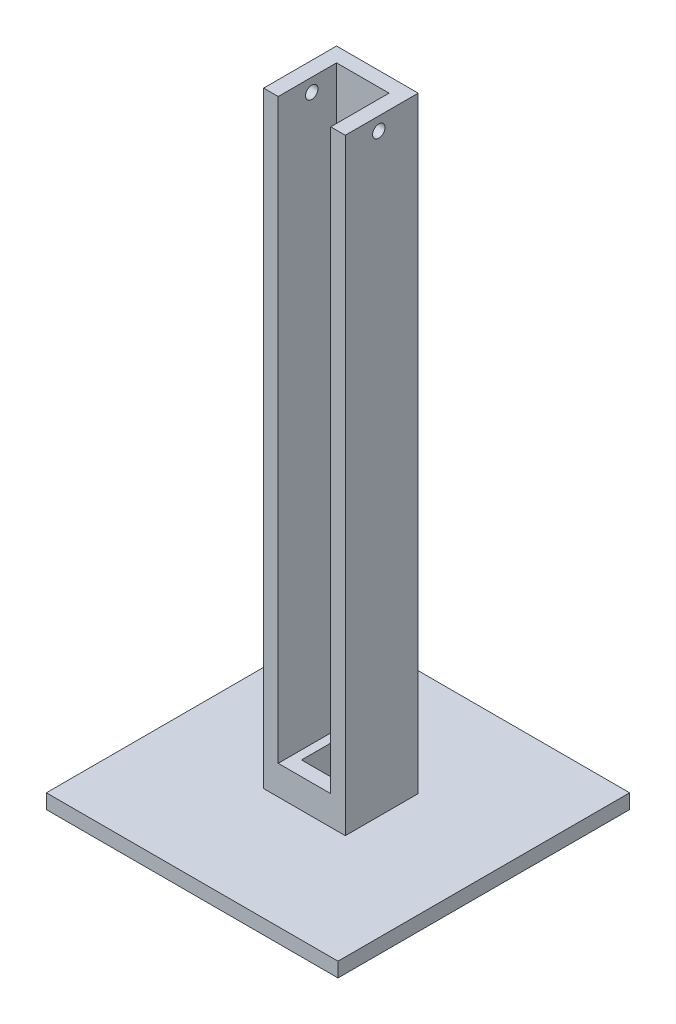
ISO-10303-21;
HEADER;
FILE_DESCRIPTION(('STEP AP214'),'2;1');
FILE_NAME('part.step','',(''),(''),'','','');
FILE_SCHEMA(('AUTOMOTIVE_DESIGN { 1 0 10303 214 1 1 1 1 }'));
ENDSEC;
DATA;
#1=APPLICATION_CONTEXT('core data for automotive mechanical design processes');
#2=APPLICATION_PROTOCOL_DEFINITION('international standard','automotive_design',2000,#1);
#3=PRODUCT_CONTEXT('',#1,'mechanical');
#4=PRODUCT('Part','Part','',(#3));
#5=PRODUCT_RELATED_PRODUCT_CATEGORY('part','',(#4));
#6=PRODUCT_DEFINITION_FORMATION('','',#4);
#7=PRODUCT_DEFINITION_CONTEXT('part definition',#1,'design');
#8=PRODUCT_DEFINITION('design','',#6,#7);
#9=PRODUCT_DEFINITION_SHAPE('','',#8);
#10=(LENGTH_UNIT() NAMED_UNIT(*) SI_UNIT(.MILLI.,.METRE.));
#11=(NAMED_UNIT(*) PLANE_ANGLE_UNIT() SI_UNIT($,.RADIAN.));
#12=(NAMED_UNIT(*) SI_UNIT($,.STERADIAN.) SOLID_ANGLE_UNIT());
#13=UNCERTAINTY_MEASURE_WITH_UNIT(LENGTH_MEASURE(1.E-05),#10,'distance_accuracy_value','');
#14=(GEOMETRIC_REPRESENTATION_CONTEXT(3) GLOBAL_UNCERTAINTY_ASSIGNED_CONTEXT((#13)) GLOBAL_UNIT_ASSIGNED_CONTEXT((#10,
#11,#12)) REPRESENTATION_CONTEXT('',''));
#15=CARTESIAN_POINT('',(0.,0.,0.));
#16=DIRECTION('',(0.,0.,1.));
#17=DIRECTION('',(1.,0.,0.));
#18=AXIS2_PLACEMENT_3D('',#15,#16,#17);
#19=CARTESIAN_POINT('',(9.00000000000003,-208.,11.5));
#20=DIRECTION('',(-1.,0.,0.));
#21=DIRECTION('',(0.,0.,1.));
#22=AXIS2_PLACEMENT_3D('',#19,#20,#21);
#23=PLANE('',#22);
#24=CARTESIAN_POINT('',(9.00000000000002,-4.5,0.));
#25=DIRECTION('',(-1.,0.,0.));
#26=DIRECTION('',(0.,0.,1.));
#27=AXIS2_PLACEMENT_3D('',#24,#25,#26);
#28=CIRCLE('',#27,2.125);
#29=CARTESIAN_POINT('',(9.00000000000002,-4.5,2.125));
#30=VERTEX_POINT('',#29);
#31=EDGE_CURVE('E232',#30,#30,#28,.T.);
#32=ORIENTED_EDGE('',*,*,#31,.F.);
#33=EDGE_LOOP('',(#32));
#34=FACE_BOUND('',#33,.T.);
#35=DIRECTION('',(0.,1.,0.));
#36=VECTOR('',#35,1.);
#37=CARTESIAN_POINT('',(9.00000000000002,-208.,-8.5));
#38=LINE('',#37,#36);
#39=CARTESIAN_POINT('',(9.00000000000002,-198.,-8.5));
#40=VERTEX_POINT('',#39);
#41=CARTESIAN_POINT('',(9.00000000000002,0.,-8.5));
#42=VERTEX_POINT('',#41);
#43=EDGE_CURVE('E42',#40,#42,#38,.T.);
#44=ORIENTED_EDGE('',*,*,#43,.F.);
#45=DIRECTION('',(0.,0.,-1.));
#46=VECTOR('',#45,1.);
#47=CARTESIAN_POINT('',(9.00000000000002,-198.,-11.5));
#48=LINE('',#47,#46);
#49=CARTESIAN_POINT('',(9.00000000000003,-198.,11.5));
#50=VERTEX_POINT('',#49);
#51=EDGE_CURVE('E187',#50,#40,#48,.T.);
#52=ORIENTED_EDGE('',*,*,#51,.F.);
#53=DIRECTION('',(0.,1.,0.));
#54=VECTOR('',#53,1.);
#55=CARTESIAN_POINT('',(9.00000000000003,-208.,11.5));
#56=LINE('',#55,#54);
#57=CARTESIAN_POINT('',(9.00000000000003,0.,11.5));
#58=VERTEX_POINT('',#57);
#59=EDGE_CURVE('E251',#50,#58,#56,.T.);
#60=ORIENTED_EDGE('',*,*,#59,.T.);
#61=DIRECTION('',(0.,0.,1.));
#62=VECTOR('',#61,1.);
#63=CARTESIAN_POINT('',(9.00000000000003,0.,11.5));
#64=LINE('',#63,#62);
#65=EDGE_CURVE('E235',#42,#58,#64,.T.);
#66=ORIENTED_EDGE('',*,*,#65,.F.);
#67=EDGE_LOOP('',(#44,#52,#60,#66));
#68=FACE_BOUND('',#67,.T.);
#69=ADVANCED_FACE('F35',(#34,#68),#23,.T.);
#70=CARTESIAN_POINT('',(9.00000000000002,-208.,-8.5));
#71=DIRECTION('',(0.,0.,1.));
#72=DIRECTION('',(1.,0.,0.));
#73=AXIS2_PLACEMENT_3D('',#70,#71,#72);
#74=PLANE('',#73);
#75=DIRECTION('',(0.,-1.,0.));
#76=VECTOR('',#75,1.);
#77=CARTESIAN_POINT('',(6.00000000000002,-208.,-8.5));
#78=LINE('',#77,#76);
#79=CARTESIAN_POINT('',(6.00000000000002,-198.,-8.5));
#80=VERTEX_POINT('',#79);
#81=CARTESIAN_POINT('',(6.00000000000002,-208.,-8.5));
#82=VERTEX_POINT('',#81);
#83=EDGE_CURVE('E49',#80,#82,#78,.T.);
#84=ORIENTED_EDGE('',*,*,#83,.F.);
#85=DIRECTION('',(1.,0.,0.));
#86=VECTOR('',#85,1.);
#87=CARTESIAN_POINT('',(9.00000000000002,-198.,-8.5));
#88=LINE('',#87,#86);
#89=EDGE_CURVE('E171',#80,#40,#88,.T.);
#90=ORIENTED_EDGE('',*,*,#89,.T.);
#91=ORIENTED_EDGE('',*,*,#43,.T.);
#92=DIRECTION('',(1.,0.,0.));
#93=VECTOR('',#92,1.);
#94=CARTESIAN_POINT('',(9.00000000000002,0.,-8.5));
#95=LINE('',#94,#93);
#96=CARTESIAN_POINT('',(-9.00000000000002,0.,-8.5));
#97=VERTEX_POINT('',#96);
#98=EDGE_CURVE('E240',#97,#42,#95,.T.);
#99=ORIENTED_EDGE('',*,*,#98,.F.);
#100=DIRECTION('',(0.,1.,0.));
#101=VECTOR('',#100,1.);
#102=CARTESIAN_POINT('',(-9.00000000000002,-208.,-8.5));
#103=LINE('',#102,#101);
#104=CARTESIAN_POINT('',(-9.00000000000002,-198.,-8.5));
#105=VERTEX_POINT('',#104);
#106=EDGE_CURVE('E275',#105,#97,#103,.T.);
#107=ORIENTED_EDGE('',*,*,#106,.F.);
#108=CARTESIAN_POINT('',(-6.00000000000002,-198.,-8.5));
#109=VERTEX_POINT('',#108);
#110=EDGE_CURVE('E56',#105,#109,#88,.T.);
#111=ORIENTED_EDGE('',*,*,#110,.T.);
#112=DIRECTION('',(0.,1.,0.));
#113=VECTOR('',#112,1.);
#114=CARTESIAN_POINT('',(-6.00000000000002,-208.,-8.5));
#115=LINE('',#114,#113);
#116=CARTESIAN_POINT('',(-6.00000000000002,-208.,-8.5));
#117=VERTEX_POINT('',#116);
#118=EDGE_CURVE('E189',#117,#109,#115,.T.);
#119=ORIENTED_EDGE('',*,*,#118,.F.);
#120=DIRECTION('',(1.,0.,0.));
#121=VECTOR('',#120,1.);
#122=CARTESIAN_POINT('',(9.00000000000002,-208.,-8.5));
#123=LINE('',#122,#121);
#124=EDGE_CURVE('E249',#117,#82,#123,.T.);
#125=ORIENTED_EDGE('',*,*,#124,.T.);
#126=EDGE_LOOP('',(#84,#90,#91,#99,#107,#111,#119,#125));
#127=FACE_BOUND('',#126,.T.);
#128=ADVANCED_FACE('F301',(#127),#74,.T.);
#129=CARTESIAN_POINT('',(-9.00000000000002,-208.,-8.5));
#130=DIRECTION('',(1.,0.,0.));
#131=DIRECTION('',(0.,0.,-1.));
#132=AXIS2_PLACEMENT_3D('',#129,#130,#131);
#133=PLANE('',#132);
#134=CARTESIAN_POINT('',(-9.00000000000002,-4.5,0.));
#135=DIRECTION('',(1.,0.,0.));
#136=DIRECTION('',(0.,0.,-1.));
#137=AXIS2_PLACEMENT_3D('',#134,#135,#136);
#138=CIRCLE('',#137,2.125);
#139=CARTESIAN_POINT('',(-9.00000000000002,-4.5,-2.125));
#140=VERTEX_POINT('',#139);
#141=EDGE_CURVE('E229',#140,#140,#138,.T.);
#142=ORIENTED_EDGE('',*,*,#141,.F.);
#143=EDGE_LOOP('',(#142));
#144=FACE_BOUND('',#143,.T.);
#145=DIRECTION('',(0.,1.,0.));
#146=VECTOR('',#145,1.);
#147=CARTESIAN_POINT('',(-9.00000000000002,-208.,11.5));
#148=LINE('',#147,#146);
#149=CARTESIAN_POINT('',(-9.00000000000002,-198.,11.5));
#150=VERTEX_POINT('',#149);
#151=CARTESIAN_POINT('',(-9.00000000000002,0.,11.5));
#152=VERTEX_POINT('',#151);
#153=EDGE_CURVE('E277',#150,#152,#148,.T.);
#154=ORIENTED_EDGE('',*,*,#153,.F.);
#155=DIRECTION('',(0.,0.,1.));
#156=VECTOR('',#155,1.);
#157=CARTESIAN_POINT('',(-9.00000000000002,-198.,11.5));
#158=LINE('',#157,#156);
#159=EDGE_CURVE('E167',#105,#150,#158,.T.);
#160=ORIENTED_EDGE('',*,*,#159,.F.);
#161=ORIENTED_EDGE('',*,*,#106,.T.);
#162=DIRECTION('',(0.,0.,-1.));
#163=VECTOR('',#162,1.);
#164=CARTESIAN_POINT('',(-9.00000000000002,0.,-8.5));
#165=LINE('',#164,#163);
#166=EDGE_CURVE('E269',#152,#97,#165,.T.);
#167=ORIENTED_EDGE('',*,*,#166,.F.);
#168=EDGE_LOOP('',(#154,#160,#161,#167));
#169=FACE_BOUND('',#168,.T.);
#170=ADVANCED_FACE('F304',(#144,#169),#133,.T.);
#171=CARTESIAN_POINT('',(0.,-208.,0.));
#172=DIRECTION('',(0.,1.,0.));
#173=DIRECTION('',(0.,0.,1.));
#174=AXIS2_PLACEMENT_3D('',#171,#172,#173);
#175=PLANE('',#174);
#176=DIRECTION('',(0.,0.,-1.));
#177=VECTOR('',#176,1.);
#178=CARTESIAN_POINT('',(-50.,-208.,-50.));
#179=LINE('',#178,#177);
#180=CARTESIAN_POINT('',(-50.,-208.,50.));
#181=VERTEX_POINT('',#180);
#182=CARTESIAN_POINT('',(-50.,-208.,-50.));
#183=VERTEX_POINT('',#182);
#184=EDGE_CURVE('E204',#181,#183,#179,.T.);
#185=ORIENTED_EDGE('',*,*,#184,.F.);
#186=DIRECTION('',(-1.,0.,0.));
#187=VECTOR('',#186,1.);
#188=CARTESIAN_POINT('',(-50.,-208.,50.));
#189=LINE('',#188,#187);
#190=CARTESIAN_POINT('',(50.,-208.,50.));
#191=VERTEX_POINT('',#190);
#192=EDGE_CURVE('E197',#191,#181,#189,.T.);
#193=ORIENTED_EDGE('',*,*,#192,.F.);
#194=DIRECTION('',(0.,0.,1.));
#195=VECTOR('',#194,1.);
#196=CARTESIAN_POINT('',(50.,-208.,-50.));
#197=LINE('',#196,#195);
#198=CARTESIAN_POINT('',(50.,-208.,-50.));
#199=VERTEX_POINT('',#198);
#200=EDGE_CURVE('E209',#199,#191,#197,.T.);
#201=ORIENTED_EDGE('',*,*,#200,.F.);
#202=DIRECTION('',(1.,0.,0.));
#203=VECTOR('',#202,1.);
#204=CARTESIAN_POINT('',(-50.,-208.,-50.));
#205=LINE('',#204,#203);
#206=EDGE_CURVE('E207',#183,#199,#205,.T.);
#207=ORIENTED_EDGE('',*,*,#206,.F.);
#208=EDGE_LOOP('',(#185,#193,#201,#207));
#209=FACE_BOUND('',#208,.T.);
#210=DIRECTION('',(1.,0.,0.));
#211=VECTOR('',#210,1.);
#212=CARTESIAN_POINT('',(14.,-208.,11.5));
#213=LINE('',#212,#211);
#214=CARTESIAN_POINT('',(-14.,-208.,11.5));
#215=VERTEX_POINT('',#214);
#216=CARTESIAN_POINT('',(14.,-208.,11.5));
#217=VERTEX_POINT('',#216);
#218=EDGE_CURVE('E236',#215,#217,#213,.T.);
#219=ORIENTED_EDGE('',*,*,#218,.F.);
#220=DIRECTION('',(0.,0.,1.));
#221=VECTOR('',#220,1.);
#222=CARTESIAN_POINT('',(-14.,-208.,-13.5));
#223=LINE('',#222,#221);
#224=CARTESIAN_POINT('',(-14.,-208.,-13.5));
#225=VERTEX_POINT('',#224);
#226=EDGE_CURVE('E246',#225,#215,#223,.T.);
#227=ORIENTED_EDGE('',*,*,#226,.F.);
#228=DIRECTION('',(-1.,0.,0.));
#229=VECTOR('',#228,1.);
#230=CARTESIAN_POINT('',(14.,-208.,-13.5));
#231=LINE('',#230,#229);
#232=CARTESIAN_POINT('',(14.,-208.,-13.5));
#233=VERTEX_POINT('',#232);
#234=EDGE_CURVE('E243',#233,#225,#231,.T.);
#235=ORIENTED_EDGE('',*,*,#234,.F.);
#236=DIRECTION('',(0.,0.,-1.));
#237=VECTOR('',#236,1.);
#238=CARTESIAN_POINT('',(14.,-208.,11.5));
#239=LINE('',#238,#237);
#240=EDGE_CURVE('E239',#217,#233,#239,.T.);
#241=ORIENTED_EDGE('',*,*,#240,.F.);
#242=EDGE_LOOP('',(#219,#227,#235,#241));
#243=FACE_BOUND('',#242,.T.);
#244=ADVANCED_FACE('F311',(#209,#243),#175,.T.);
#245=CARTESIAN_POINT('',(-9.00000000000002,-208.,11.5));
#246=DIRECTION('',(0.,0.,1.));
#247=DIRECTION('',(1.,0.,0.));
#248=AXIS2_PLACEMENT_3D('',#245,#246,#247);
#249=PLANE('',#248);
#250=DIRECTION('',(1.,0.,0.));
#251=VECTOR('',#250,1.);
#252=CARTESIAN_POINT('',(-9.00000000000002,0.,11.5));
#253=LINE('',#252,#251);
#254=CARTESIAN_POINT('',(-14.,0.,11.5));
#255=VERTEX_POINT('',#254);
#256=EDGE_CURVE('E266',#255,#152,#253,.T.);
#257=ORIENTED_EDGE('',*,*,#256,.F.);
#258=DIRECTION('',(0.,1.,0.));
#259=VECTOR('',#258,1.);
#260=CARTESIAN_POINT('',(-14.,-208.,11.5));
#261=LINE('',#260,#259);
#262=EDGE_CURVE('E279',#215,#255,#261,.T.);
#263=ORIENTED_EDGE('',*,*,#262,.F.);
#264=ORIENTED_EDGE('',*,*,#218,.T.);
#265=DIRECTION('',(0.,1.,0.));
#266=VECTOR('',#265,1.);
#267=CARTESIAN_POINT('',(14.,-208.,11.5));
#268=LINE('',#267,#266);
#269=CARTESIAN_POINT('',(14.,0.,11.5));
#270=VERTEX_POINT('',#269);
#271=EDGE_CURVE('E285',#217,#270,#268,.T.);
#272=ORIENTED_EDGE('',*,*,#271,.T.);
#273=DIRECTION('',(1.,0.,0.));
#274=VECTOR('',#273,1.);
#275=CARTESIAN_POINT('',(14.,0.,11.5));
#276=LINE('',#275,#274);
#277=EDGE_CURVE('E254',#58,#270,#276,.T.);
#278=ORIENTED_EDGE('',*,*,#277,.F.);
#279=ORIENTED_EDGE('',*,*,#59,.F.);
#280=DIRECTION('',(1.,0.,0.));
#281=VECTOR('',#280,1.);
#282=CARTESIAN_POINT('',(-9.00000000000002,-198.,11.5));
#283=LINE('',#282,#281);
#284=EDGE_CURVE('E184',#150,#50,#283,.T.);
#285=ORIENTED_EDGE('',*,*,#284,.F.);
#286=ORIENTED_EDGE('',*,*,#153,.T.);
#287=EDGE_LOOP('',(#257,#263,#264,#272,#278,#279,#285,#286));
#288=FACE_BOUND('',#287,.T.);
#289=ADVANCED_FACE('F294',(#288),#249,.T.);
#290=CARTESIAN_POINT('',(-14.,-208.,-13.5));
#291=DIRECTION('',(-1.,0.,0.));
#292=DIRECTION('',(0.,0.,1.));
#293=AXIS2_PLACEMENT_3D('',#290,#291,#292);
#294=PLANE('',#293);
#295=CARTESIAN_POINT('',(-14.,-4.5,0.));
#296=DIRECTION('',(-1.,0.,0.));
#297=DIRECTION('',(0.,0.,1.));
#298=AXIS2_PLACEMENT_3D('',#295,#296,#297);
#299=CIRCLE('',#298,2.125);
#300=CARTESIAN_POINT('',(-14.,-4.5,-2.125));
#301=VERTEX_POINT('',#300);
#302=EDGE_CURVE('E226',#301,#301,#299,.F.);
#303=ORIENTED_EDGE('',*,*,#302,.T.);
#304=EDGE_LOOP('',(#303));
#305=FACE_BOUND('',#304,.T.);
#306=DIRECTION('',(0.,0.,1.));
#307=VECTOR('',#306,1.);
#308=CARTESIAN_POINT('',(-14.,0.,-13.5));
#309=LINE('',#308,#307);
#310=CARTESIAN_POINT('',(-14.,0.,-13.5));
#311=VERTEX_POINT('',#310);
#312=EDGE_CURVE('E263',#311,#255,#309,.T.);
#313=ORIENTED_EDGE('',*,*,#312,.F.);
#314=DIRECTION('',(0.,1.,0.));
#315=VECTOR('',#314,1.);
#316=CARTESIAN_POINT('',(-14.,-208.,-13.5));
#317=LINE('',#316,#315);
#318=EDGE_CURVE('E281',#225,#311,#317,.T.);
#319=ORIENTED_EDGE('',*,*,#318,.F.);
#320=ORIENTED_EDGE('',*,*,#226,.T.);
#321=ORIENTED_EDGE('',*,*,#262,.T.);
#322=EDGE_LOOP('',(#313,#319,#320,#321));
#323=FACE_BOUND('',#322,.T.);
#324=ADVANCED_FACE('F309',(#305,#323),#294,.T.);
#325=CARTESIAN_POINT('',(14.,-208.,-13.5));
#326=DIRECTION('',(0.,0.,-1.));
#327=DIRECTION('',(-1.,0.,0.));
#328=AXIS2_PLACEMENT_3D('',#325,#326,#327);
#329=PLANE('',#328);
#330=DIRECTION('',(-1.,0.,0.));
#331=VECTOR('',#330,1.);
#332=CARTESIAN_POINT('',(14.,0.,-13.5));
#333=LINE('',#332,#331);
#334=CARTESIAN_POINT('',(14.,0.,-13.5));
#335=VERTEX_POINT('',#334);
#336=EDGE_CURVE('E260',#335,#311,#333,.T.);
#337=ORIENTED_EDGE('',*,*,#336,.F.);
#338=DIRECTION('',(0.,1.,0.));
#339=VECTOR('',#338,1.);
#340=CARTESIAN_POINT('',(14.,-208.,-13.5));
#341=LINE('',#340,#339);
#342=EDGE_CURVE('E283',#233,#335,#341,.T.);
#343=ORIENTED_EDGE('',*,*,#342,.F.);
#344=ORIENTED_EDGE('',*,*,#234,.T.);
#345=ORIENTED_EDGE('',*,*,#318,.T.);
#346=EDGE_LOOP('',(#337,#343,#344,#345));
#347=FACE_BOUND('',#346,.T.);
#348=ADVANCED_FACE('F316',(#347),#329,.T.);
#349=CARTESIAN_POINT('',(14.,-208.,11.5));
#350=DIRECTION('',(1.,0.,0.));
#351=DIRECTION('',(0.,0.,-1.));
#352=AXIS2_PLACEMENT_3D('',#349,#350,#351);
#353=PLANE('',#352);
#354=CARTESIAN_POINT('',(14.,-4.5,0.));
#355=DIRECTION('',(1.,0.,0.));
#356=DIRECTION('',(0.,0.,-1.));
#357=AXIS2_PLACEMENT_3D('',#354,#355,#356);
#358=CIRCLE('',#357,2.125);
#359=CARTESIAN_POINT('',(14.,-4.5,-2.125));
#360=VERTEX_POINT('',#359);
#361=EDGE_CURVE('E223',#360,#360,#358,.T.);
#362=ORIENTED_EDGE('',*,*,#361,.F.);
#363=EDGE_LOOP('',(#362));
#364=FACE_BOUND('',#363,.T.);
#365=DIRECTION('',(0.,0.,-1.));
#366=VECTOR('',#365,1.);
#367=CARTESIAN_POINT('',(14.,0.,11.5));
#368=LINE('',#367,#366);
#369=EDGE_CURVE('E257',#270,#335,#368,.T.);
#370=ORIENTED_EDGE('',*,*,#369,.F.);
#371=ORIENTED_EDGE('',*,*,#271,.F.);
#372=ORIENTED_EDGE('',*,*,#240,.T.);
#373=ORIENTED_EDGE('',*,*,#342,.T.);
#374=EDGE_LOOP('',(#370,#371,#372,#373));
#375=FACE_BOUND('',#374,.T.);
#376=ADVANCED_FACE('F314',(#364,#375),#353,.T.);
#377=CARTESIAN_POINT('',(0.,0.,0.));
#378=DIRECTION('',(0.,1.,0.));
#379=DIRECTION('',(0.,0.,1.));
#380=AXIS2_PLACEMENT_3D('',#377,#378,#379);
#381=PLANE('',#380);
#382=ORIENTED_EDGE('',*,*,#65,.T.);
#383=ORIENTED_EDGE('',*,*,#277,.T.);
#384=ORIENTED_EDGE('',*,*,#369,.T.);
#385=ORIENTED_EDGE('',*,*,#336,.T.);
#386=ORIENTED_EDGE('',*,*,#312,.T.);
#387=ORIENTED_EDGE('',*,*,#256,.T.);
#388=ORIENTED_EDGE('',*,*,#166,.T.);
#389=ORIENTED_EDGE('',*,*,#98,.T.);
#390=EDGE_LOOP('',(#382,#383,#384,#385,#386,#387,#388,#389));
#391=FACE_BOUND('',#390,.T.);
#392=ADVANCED_FACE('F298',(#391),#381,.T.);
#393=CARTESIAN_POINT('',(-20.0104076400857,-4.5,0.));
#394=DIRECTION('',(1.,0.,0.));
#395=DIRECTION('',(0.,0.,-1.));
#396=AXIS2_PLACEMENT_3D('',#393,#394,#395);
#397=CYLINDRICAL_SURFACE('',#396,2.125);
#398=ORIENTED_EDGE('',*,*,#31,.T.);
#399=EDGE_LOOP('',(#398));
#400=FACE_BOUND('',#399,.T.);
#401=ORIENTED_EDGE('',*,*,#361,.T.);
#402=EDGE_LOOP('',(#401));
#403=FACE_BOUND('',#402,.T.);
#404=ADVANCED_FACE('F334',(#400,#403),#397,.F.);
#405=CARTESIAN_POINT('',(-9.00000000000002,-4.5,-2.125));
#406=CARTESIAN_POINT('',(-9.05208333333336,-4.5,-2.125));
#407=CARTESIAN_POINT('',(-9.10416666666669,-4.5,-2.125));
#408=CARTESIAN_POINT('',(-9.20833333333336,-4.5,-2.125));
#409=CARTESIAN_POINT('',(-9.26041666666669,-4.5,-2.125));
#410=CARTESIAN_POINT('',(-9.36458333333336,-4.5,-2.125));
#411=CARTESIAN_POINT('',(-9.41666666666669,-4.5,-2.125));
#412=CARTESIAN_POINT('',(-9.52083333333336,-4.5,-2.125));
#413=CARTESIAN_POINT('',(-9.57291666666669,-4.5,-2.125));
#414=CARTESIAN_POINT('',(-9.67708333333336,-4.5,-2.125));
#415=CARTESIAN_POINT('',(-9.72916666666669,-4.5,-2.125));
#416=CARTESIAN_POINT('',(-9.83333333333336,-4.5,-2.125));
#417=CARTESIAN_POINT('',(-9.88541666666669,-4.5,-2.125));
#418=CARTESIAN_POINT('',(-9.98958333333335,-4.5,-2.125));
#419=CARTESIAN_POINT('',(-10.0416666666667,-4.5,-2.125));
#420=CARTESIAN_POINT('',(-10.1458333333334,-4.5,-2.125));
#421=CARTESIAN_POINT('',(-10.1979166666667,-4.5,-2.125));
#422=CARTESIAN_POINT('',(-10.3020833333334,-4.5,-2.125));
#423=CARTESIAN_POINT('',(-10.3541666666667,-4.5,-2.125));
#424=CARTESIAN_POINT('',(-10.4583333333334,-4.5,-2.125));
#425=CARTESIAN_POINT('',(-10.5104166666667,-4.5,-2.125));
#426=CARTESIAN_POINT('',(-10.6145833333334,-4.5,-2.125));
#427=CARTESIAN_POINT('',(-10.6666666666667,-4.5,-2.125));
#428=CARTESIAN_POINT('',(-10.7708333333334,-4.5,-2.125));
#429=CARTESIAN_POINT('',(-10.8229166666667,-4.5,-2.125));
#430=CARTESIAN_POINT('',(-10.9270833333334,-4.5,-2.125));
#431=CARTESIAN_POINT('',(-10.9791666666667,-4.5,-2.125));
#432=CARTESIAN_POINT('',(-11.0833333333334,-4.5,-2.125));
#433=CARTESIAN_POINT('',(-11.1354166666667,-4.5,-2.125));
#434=CARTESIAN_POINT('',(-11.2395833333334,-4.5,-2.125));
#435=CARTESIAN_POINT('',(-11.2916666666667,-4.5,-2.125));
#436=CARTESIAN_POINT('',(-11.3958333333334,-4.5,-2.125));
#437=CARTESIAN_POINT('',(-11.4479166666667,-4.5,-2.125));
#438=CARTESIAN_POINT('',(-11.5520833333334,-4.5,-2.125));
#439=CARTESIAN_POINT('',(-11.6041666666667,-4.5,-2.125));
#440=CARTESIAN_POINT('',(-11.7083333333334,-4.5,-2.125));
#441=CARTESIAN_POINT('',(-11.7604166666667,-4.5,-2.125));
#442=CARTESIAN_POINT('',(-11.8645833333334,-4.5,-2.125));
#443=CARTESIAN_POINT('',(-11.9166666666667,-4.5,-2.125));
#444=CARTESIAN_POINT('',(-12.0208333333334,-4.5,-2.125));
#445=CARTESIAN_POINT('',(-12.0729166666667,-4.5,-2.125));
#446=CARTESIAN_POINT('',(-12.1770833333334,-4.5,-2.125));
#447=CARTESIAN_POINT('',(-12.2291666666667,-4.5,-2.125));
#448=CARTESIAN_POINT('',(-12.3333333333334,-4.5,-2.125));
#449=CARTESIAN_POINT('',(-12.3854166666667,-4.5,-2.125));
#450=CARTESIAN_POINT('',(-12.4895833333334,-4.5,-2.125));
#451=CARTESIAN_POINT('',(-12.5416666666667,-4.5,-2.125));
#452=CARTESIAN_POINT('',(-12.6458333333334,-4.5,-2.125));
#453=CARTESIAN_POINT('',(-12.6979166666667,-4.5,-2.125));
#454=CARTESIAN_POINT('',(-12.8020833333334,-4.5,-2.125));
#455=CARTESIAN_POINT('',(-12.8541666666667,-4.5,-2.125));
#456=CARTESIAN_POINT('',(-12.9583333333334,-4.5,-2.125));
#457=CARTESIAN_POINT('',(-13.0104166666667,-4.5,-2.125));
#458=CARTESIAN_POINT('',(-13.1145833333334,-4.5,-2.125));
#459=CARTESIAN_POINT('',(-13.1666666666667,-4.5,-2.125));
#460=CARTESIAN_POINT('',(-13.2708333333334,-4.5,-2.125));
#461=CARTESIAN_POINT('',(-13.3229166666667,-4.5,-2.125));
#462=CARTESIAN_POINT('',(-13.4270833333334,-4.5,-2.125));
#463=CARTESIAN_POINT('',(-13.4791666666667,-4.5,-2.125));
#464=CARTESIAN_POINT('',(-13.5833333333334,-4.5,-2.125));
#465=CARTESIAN_POINT('',(-13.6354166666667,-4.5,-2.125));
#466=CARTESIAN_POINT('',(-13.7395833333334,-4.5,-2.125));
#467=CARTESIAN_POINT('',(-13.7916666666667,-4.5,-2.125));
#468=CARTESIAN_POINT('',(-13.8958333333334,-4.5,-2.125));
#469=CARTESIAN_POINT('',(-13.9479166666667,-4.5,-2.125));
#470=CARTESIAN_POINT('',(-14.,-4.5,-2.125));
#471=B_SPLINE_CURVE_WITH_KNOTS('',3,(#405,#406,#407,#408,#409,#410,#411,#412,#413,#414,#415,
#416,#417,#418,#419,#420,#421,#422,#423,#424,#425,#426,#427,#428,#429,#430,#431,#432,#433,#434,
#435,#436,#437,#438,#439,#440,#441,#442,#443,#444,#445,#446,#447,#448,#449,#450,#451,#452,#453,
#454,#455,#456,#457,#458,#459,#460,#461,#462,#463,#464,#465,#466,#467,#468,#469,#470),
.UNSPECIFIED.,.F.,.F.,(4,2,2,2,2,2,2,2,2,2,2,2,2,2,2,2,2,2,2,2,2,2,2,2,2,2,2,2,2,2,2,2,4),(0.,
0.15625,0.3125,0.46875,0.625000000000001,0.781250000000001,0.937499999999999,1.09375,1.25,
1.40625,1.5625,1.71875,1.875,2.03125,2.1875,2.34375,2.5,2.65625,2.8125,2.96875,3.125,3.28125,
3.4375,3.59375,3.75,3.90625,4.0625,4.21875,4.375,4.53125,4.6875,4.84375,5.),.UNSPECIFIED.);
#472=EDGE_CURVE('BSEAM337',#140,#301,#471,.T.);
#473=ORIENTED_EDGE('',*,*,#141,.T.);
#474=ORIENTED_EDGE('',*,*,#302,.F.);
#475=ORIENTED_EDGE('',*,*,#472,.T.);
#476=ORIENTED_EDGE('',*,*,#472,.F.);
#477=EDGE_LOOP('',(#473,#475,#474,#476));
#478=FACE_BOUND('',#477,.T.);
#479=ADVANCED_FACE('F337',(#478),#397,.F.);
#480=CARTESIAN_POINT('',(-50.,-213.,-50.));
#481=DIRECTION('',(1.,0.,0.));
#482=DIRECTION('',(0.,0.,-1.));
#483=AXIS2_PLACEMENT_3D('',#480,#481,#482);
#484=PLANE('',#483);
#485=ORIENTED_EDGE('',*,*,#184,.T.);
#486=DIRECTION('',(0.,1.,0.));
#487=VECTOR('',#486,1.);
#488=CARTESIAN_POINT('',(-50.,-213.,-50.));
#489=LINE('',#488,#487);
#490=CARTESIAN_POINT('',(-50.,-213.,-50.));
#491=VERTEX_POINT('',#490);
#492=EDGE_CURVE('E220',#491,#183,#489,.T.);
#493=ORIENTED_EDGE('',*,*,#492,.F.);
#494=DIRECTION('',(0.,0.,-1.));
#495=VECTOR('',#494,1.);
#496=CARTESIAN_POINT('',(-50.,-213.,-50.));
#497=LINE('',#496,#495);
#498=CARTESIAN_POINT('',(-50.,-213.,50.));
#499=VERTEX_POINT('',#498);
#500=EDGE_CURVE('E193',#499,#491,#497,.T.);
#501=ORIENTED_EDGE('',*,*,#500,.F.);
#502=DIRECTION('',(0.,1.,0.));
#503=VECTOR('',#502,1.);
#504=CARTESIAN_POINT('',(-50.,-213.,50.));
#505=LINE('',#504,#503);
#506=EDGE_CURVE('E203',#499,#181,#505,.T.);
#507=ORIENTED_EDGE('',*,*,#506,.T.);
#508=EDGE_LOOP('',(#485,#493,#501,#507));
#509=FACE_BOUND('',#508,.T.);
#510=ADVANCED_FACE('F344',(#509),#484,.F.);
#511=CARTESIAN_POINT('',(-50.,-213.,-50.));
#512=DIRECTION('',(0.,0.,1.));
#513=DIRECTION('',(1.,0.,0.));
#514=AXIS2_PLACEMENT_3D('',#511,#512,#513);
#515=PLANE('',#514);
#516=ORIENTED_EDGE('',*,*,#206,.T.);
#517=DIRECTION('',(0.,1.,0.));
#518=VECTOR('',#517,1.);
#519=CARTESIAN_POINT('',(50.,-213.,-50.));
#520=LINE('',#519,#518);
#521=CARTESIAN_POINT('',(50.,-213.,-50.));
#522=VERTEX_POINT('',#521);
#523=EDGE_CURVE('E217',#522,#199,#520,.T.);
#524=ORIENTED_EDGE('',*,*,#523,.F.);
#525=DIRECTION('',(1.,0.,0.));
#526=VECTOR('',#525,1.);
#527=CARTESIAN_POINT('',(-50.,-213.,-50.));
#528=LINE('',#527,#526);
#529=EDGE_CURVE('E196',#491,#522,#528,.T.);
#530=ORIENTED_EDGE('',*,*,#529,.F.);
#531=ORIENTED_EDGE('',*,*,#492,.T.);
#532=EDGE_LOOP('',(#516,#524,#530,#531));
#533=FACE_BOUND('',#532,.T.);
#534=ADVANCED_FACE('F496',(#533),#515,.F.);
#535=CARTESIAN_POINT('',(50.,-213.,-50.));
#536=DIRECTION('',(-1.,0.,0.));
#537=DIRECTION('',(0.,0.,1.));
#538=AXIS2_PLACEMENT_3D('',#535,#536,#537);
#539=PLANE('',#538);
#540=ORIENTED_EDGE('',*,*,#200,.T.);
#541=DIRECTION('',(0.,1.,0.));
#542=VECTOR('',#541,1.);
#543=CARTESIAN_POINT('',(50.,-213.,50.));
#544=LINE('',#543,#542);
#545=CARTESIAN_POINT('',(50.,-213.,50.));
#546=VERTEX_POINT('',#545);
#547=EDGE_CURVE('E214',#546,#191,#544,.T.);
#548=ORIENTED_EDGE('',*,*,#547,.F.);
#549=DIRECTION('',(0.,0.,1.));
#550=VECTOR('',#549,1.);
#551=CARTESIAN_POINT('',(50.,-213.,-50.));
#552=LINE('',#551,#550);
#553=EDGE_CURVE('E199',#522,#546,#552,.T.);
#554=ORIENTED_EDGE('',*,*,#553,.F.);
#555=ORIENTED_EDGE('',*,*,#523,.T.);
#556=EDGE_LOOP('',(#540,#548,#554,#555));
#557=FACE_BOUND('',#556,.T.);
#558=ADVANCED_FACE('F504',(#557),#539,.F.);
#559=CARTESIAN_POINT('',(-50.,-213.,50.));
#560=DIRECTION('',(0.,0.,-1.));
#561=DIRECTION('',(-1.,0.,0.));
#562=AXIS2_PLACEMENT_3D('',#559,#560,#561);
#563=PLANE('',#562);
#564=ORIENTED_EDGE('',*,*,#192,.T.);
#565=ORIENTED_EDGE('',*,*,#506,.F.);
#566=DIRECTION('',(-1.,0.,0.));
#567=VECTOR('',#566,1.);
#568=CARTESIAN_POINT('',(-50.,-213.,50.));
#569=LINE('',#568,#567);
#570=EDGE_CURVE('E201',#546,#499,#569,.T.);
#571=ORIENTED_EDGE('',*,*,#570,.F.);
#572=ORIENTED_EDGE('',*,*,#547,.T.);
#573=EDGE_LOOP('',(#564,#565,#571,#572));
#574=FACE_BOUND('',#573,.T.);
#575=ADVANCED_FACE('F373',(#574),#563,.F.);
#576=CARTESIAN_POINT('',(0.,-213.,0.));
#577=DIRECTION('',(0.,1.,0.));
#578=DIRECTION('',(0.,0.,1.));
#579=AXIS2_PLACEMENT_3D('',#576,#577,#578);
#580=PLANE('',#579);
#581=CARTESIAN_POINT('',(0.,-213.,0.));
#582=DIRECTION('',(0.,-1.,0.));
#583=DIRECTION('',(0.,0.,-1.));
#584=AXIS2_PLACEMENT_3D('',#581,#582,#583);
#585=CIRCLE('',#584,4.8);
#586=CARTESIAN_POINT('',(0.,-213.,-4.8));
#587=VERTEX_POINT('',#586);
#588=EDGE_CURVE('E179',#587,#587,#585,.T.);
#589=ORIENTED_EDGE('',*,*,#588,.F.);
#590=EDGE_LOOP('',(#589));
#591=FACE_BOUND('',#590,.T.);
#592=ORIENTED_EDGE('',*,*,#500,.T.);
#593=ORIENTED_EDGE('',*,*,#529,.T.);
#594=ORIENTED_EDGE('',*,*,#553,.T.);
#595=ORIENTED_EDGE('',*,*,#570,.T.);
#596=EDGE_LOOP('',(#592,#593,#594,#595));
#597=FACE_BOUND('',#596,.T.);
#598=ADVANCED_FACE('F366',(#591,#597),#580,.F.);
#599=CARTESIAN_POINT('',(0.,-208.,0.));
#600=DIRECTION('',(0.,1.,0.));
#601=DIRECTION('',(0.,0.,1.));
#602=AXIS2_PLACEMENT_3D('',#599,#600,#601);
#603=CIRCLE('',#602,4.8);
#604=CARTESIAN_POINT('',(0.,-208.,4.8));
#605=VERTEX_POINT('',#604);
#606=EDGE_CURVE('E378',#605,#605,#603,.F.);
#607=ORIENTED_EDGE('',*,*,#606,.T.);
#608=EDGE_LOOP('',(#607));
#609=FACE_BOUND('',#608,.T.);
#610=DIRECTION('',(0.,0.,-1.));
#611=VECTOR('',#610,1.);
#612=CARTESIAN_POINT('',(6.00000000000002,-208.,-9.));
#613=LINE('',#612,#611);
#614=CARTESIAN_POINT('',(6.00000000000003,-208.,6.5));
#615=VERTEX_POINT('',#614);
#616=EDGE_CURVE('E161',#615,#82,#613,.T.);
#617=ORIENTED_EDGE('',*,*,#616,.T.);
#618=ORIENTED_EDGE('',*,*,#124,.F.);
#619=DIRECTION('',(0.,0.,-1.));
#620=VECTOR('',#619,1.);
#621=CARTESIAN_POINT('',(-6.00000000000002,-208.,0.));
#622=LINE('',#621,#620);
#623=CARTESIAN_POINT('',(-6.00000000000002,-208.,6.5));
#624=VERTEX_POINT('',#623);
#625=EDGE_CURVE('E11',#624,#117,#622,.T.);
#626=ORIENTED_EDGE('',*,*,#625,.F.);
#627=DIRECTION('',(1.,0.,0.));
#628=VECTOR('',#627,1.);
#629=CARTESIAN_POINT('',(-6.00000000000002,-208.,6.5));
#630=LINE('',#629,#628);
#631=EDGE_CURVE('E177',#624,#615,#630,.T.);
#632=ORIENTED_EDGE('',*,*,#631,.T.);
#633=EDGE_LOOP('',(#617,#618,#626,#632));
#634=FACE_BOUND('',#633,.T.);
#635=ADVANCED_FACE('F359',(#609,#634),#175,.T.);
#636=CARTESIAN_POINT('',(0.,-198.,0.));
#637=DIRECTION('',(0.,-1.,0.));
#638=DIRECTION('',(0.,0.,-1.));
#639=AXIS2_PLACEMENT_3D('',#636,#637,#638);
#640=PLANE('',#639);
#641=ORIENTED_EDGE('',*,*,#110,.F.);
#642=ORIENTED_EDGE('',*,*,#159,.T.);
#643=ORIENTED_EDGE('',*,*,#284,.T.);
#644=ORIENTED_EDGE('',*,*,#51,.T.);
#645=ORIENTED_EDGE('',*,*,#89,.F.);
#646=DIRECTION('',(0.,0.,-1.));
#647=VECTOR('',#646,1.);
#648=CARTESIAN_POINT('',(6.00000000000002,-198.,-9.));
#649=LINE('',#648,#647);
#650=CARTESIAN_POINT('',(6.00000000000003,-198.,6.5));
#651=VERTEX_POINT('',#650);
#652=EDGE_CURVE('E160',#651,#80,#649,.T.);
#653=ORIENTED_EDGE('',*,*,#652,.F.);
#654=DIRECTION('',(1.,0.,0.));
#655=VECTOR('',#654,1.);
#656=CARTESIAN_POINT('',(-6.00000000000002,-198.,6.5));
#657=LINE('',#656,#655);
#658=CARTESIAN_POINT('',(-6.00000000000002,-198.,6.5));
#659=VERTEX_POINT('',#658);
#660=EDGE_CURVE('E150',#659,#651,#657,.T.);
#661=ORIENTED_EDGE('',*,*,#660,.F.);
#662=DIRECTION('',(0.,0.,1.));
#663=VECTOR('',#662,1.);
#664=CARTESIAN_POINT('',(-6.00000000000002,-198.,6.5));
#665=LINE('',#664,#663);
#666=EDGE_CURVE('E172',#109,#659,#665,.T.);
#667=ORIENTED_EDGE('',*,*,#666,.F.);
#668=EDGE_LOOP('',(#641,#642,#643,#644,#645,#653,#661,#667));
#669=FACE_BOUND('',#668,.T.);
#670=ADVANCED_FACE('F169',(#669),#640,.F.);
#671=CARTESIAN_POINT('',(-6.00000000000002,-198.,6.5));
#672=DIRECTION('',(0.,0.,-1.));
#673=DIRECTION('',(-1.,0.,0.));
#674=AXIS2_PLACEMENT_3D('',#671,#672,#673);
#675=PLANE('',#674);
#676=ORIENTED_EDGE('',*,*,#631,.F.);
#677=DIRECTION('',(0.,-1.,0.));
#678=VECTOR('',#677,1.);
#679=CARTESIAN_POINT('',(-6.00000000000002,-198.,6.5));
#680=LINE('',#679,#678);
#681=EDGE_CURVE('E156',#659,#624,#680,.T.);
#682=ORIENTED_EDGE('',*,*,#681,.F.);
#683=ORIENTED_EDGE('',*,*,#660,.T.);
#684=DIRECTION('',(0.,-1.,0.));
#685=VECTOR('',#684,1.);
#686=CARTESIAN_POINT('',(6.00000000000003,-198.,6.5));
#687=LINE('',#686,#685);
#688=EDGE_CURVE('E154',#651,#615,#687,.T.);
#689=ORIENTED_EDGE('',*,*,#688,.T.);
#690=EDGE_LOOP('',(#676,#682,#683,#689));
#691=FACE_BOUND('',#690,.T.);
#692=ADVANCED_FACE('F153',(#691),#675,.T.);
#693=CARTESIAN_POINT('',(6.00000000000002,-198.,-9.));
#694=DIRECTION('',(-1.,0.,0.));
#695=DIRECTION('',(0.,0.,1.));
#696=AXIS2_PLACEMENT_3D('',#693,#694,#695);
#697=PLANE('',#696);
#698=ORIENTED_EDGE('',*,*,#652,.T.);
#699=ORIENTED_EDGE('',*,*,#83,.T.);
#700=ORIENTED_EDGE('',*,*,#616,.F.);
#701=ORIENTED_EDGE('',*,*,#688,.F.);
#702=EDGE_LOOP('',(#698,#699,#700,#701));
#703=FACE_BOUND('',#702,.T.);
#704=ADVANCED_FACE('F166',(#703),#697,.T.);
#705=CARTESIAN_POINT('',(-6.00000000000002,-198.,6.5));
#706=DIRECTION('',(1.,0.,0.));
#707=DIRECTION('',(0.,0.,-1.));
#708=AXIS2_PLACEMENT_3D('',#705,#706,#707);
#709=PLANE('',#708);
#710=ORIENTED_EDGE('',*,*,#625,.T.);
#711=ORIENTED_EDGE('',*,*,#118,.T.);
#712=ORIENTED_EDGE('',*,*,#666,.T.);
#713=ORIENTED_EDGE('',*,*,#681,.T.);
#714=EDGE_LOOP('',(#710,#711,#712,#713));
#715=FACE_BOUND('',#714,.T.);
#716=ADVANCED_FACE('F380',(#715),#709,.T.);
#717=CARTESIAN_POINT('',(0.,-194.423549801218,0.));
#718=DIRECTION('',(0.,-1.,0.));
#719=DIRECTION('',(0.,0.,-1.));
#720=AXIS2_PLACEMENT_3D('',#717,#718,#719);
#721=CYLINDRICAL_SURFACE('',#720,4.8);
#722=ORIENTED_EDGE('',*,*,#588,.T.);
#723=EDGE_LOOP('',(#722));
#724=FACE_BOUND('',#723,.T.);
#725=ORIENTED_EDGE('',*,*,#606,.F.);
#726=EDGE_LOOP('',(#725));
#727=FACE_BOUND('',#726,.T.);
#728=ADVANCED_FACE('F382',(#724,#727),#721,.F.);
#729=CLOSED_SHELL('',(#69,#128,#170,#244,#289,#324,#348,#376,#392,#404,#479,#510,#534,#558,#575,
#598,#635,#670,#692,#704,#716,#728));
#730=MANIFOLD_SOLID_BREP('B2',#729);
#731=ADVANCED_BREP_SHAPE_REPRESENTATION('',(#18,#730),#14);
#732=SHAPE_DEFINITION_REPRESENTATION(#9,#731);
ENDSEC;
END-ISO-10303-21;
